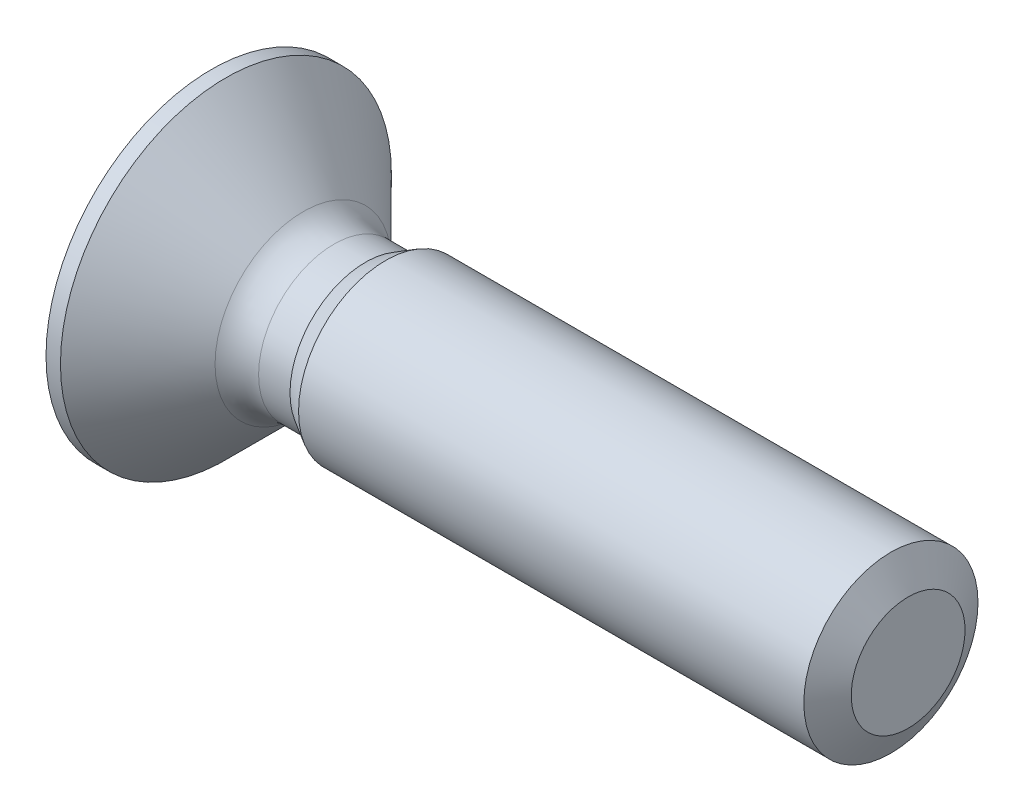
ISO-10303-21;
HEADER;
FILE_DESCRIPTION(('STEP AP214'),'2;1');
FILE_NAME('part.step','',(''),(''),'','','');
FILE_SCHEMA(('AUTOMOTIVE_DESIGN { 1 0 10303 214 1 1 1 1 }'));
ENDSEC;
DATA;
#1=APPLICATION_CONTEXT('core data for automotive mechanical design processes');
#2=APPLICATION_PROTOCOL_DEFINITION('international standard','automotive_design',2000,#1);
#3=PRODUCT_CONTEXT('',#1,'mechanical');
#4=PRODUCT('Part','Part','',(#3));
#5=PRODUCT_RELATED_PRODUCT_CATEGORY('part','',(#4));
#6=PRODUCT_DEFINITION_FORMATION('','',#4);
#7=PRODUCT_DEFINITION_CONTEXT('part definition',#1,'design');
#8=PRODUCT_DEFINITION('design','',#6,#7);
#9=PRODUCT_DEFINITION_SHAPE('','',#8);
#10=(LENGTH_UNIT() NAMED_UNIT(*) SI_UNIT(.MILLI.,.METRE.));
#11=(NAMED_UNIT(*) PLANE_ANGLE_UNIT() SI_UNIT($,.RADIAN.));
#12=(NAMED_UNIT(*) SI_UNIT($,.STERADIAN.) SOLID_ANGLE_UNIT());
#13=UNCERTAINTY_MEASURE_WITH_UNIT(LENGTH_MEASURE(1.E-05),#10,'distance_accuracy_value','');
#14=(GEOMETRIC_REPRESENTATION_CONTEXT(3) GLOBAL_UNCERTAINTY_ASSIGNED_CONTEXT((#13)) GLOBAL_UNIT_ASSIGNED_CONTEXT((#10,
#11,#12)) REPRESENTATION_CONTEXT('',''));
#15=CARTESIAN_POINT('',(0.,0.,0.));
#16=DIRECTION('',(0.,0.,1.));
#17=DIRECTION('',(1.,0.,0.));
#18=AXIS2_PLACEMENT_3D('',#15,#16,#17);
#19=CARTESIAN_POINT('',(0.,0.,0.));
#20=DIRECTION('',(1.,0.,0.));
#21=DIRECTION('',(0.,0.,-1.));
#22=AXIS2_PLACEMENT_3D('',#19,#20,#21);
#23=PLANE('',#22);
#24=CARTESIAN_POINT('',(0.,0.,0.));
#25=DIRECTION('',(-1.,0.,0.));
#26=DIRECTION('',(0.,0.,1.));
#27=AXIS2_PLACEMENT_3D('',#24,#25,#26);
#28=CIRCLE('',#27,1.9);
#29=CARTESIAN_POINT('',(0.,0.,1.9));
#30=VERTEX_POINT('',#29);
#31=EDGE_CURVE('E182',#30,#30,#28,.T.);
#32=ORIENTED_EDGE('',*,*,#31,.T.);
#33=EDGE_LOOP('',(#32));
#34=FACE_BOUND('',#33,.T.);
#35=DIRECTION('',(0.,1.,0.));
#36=VECTOR('',#35,1.);
#37=CARTESIAN_POINT('',(0.,0.95,0.200000000000003));
#38=LINE('',#37,#36);
#39=CARTESIAN_POINT('',(0.,0.2,0.200000000000001));
#40=VERTEX_POINT('',#39);
#41=CARTESIAN_POINT('',(0.,0.95,0.200000000000003));
#42=VERTEX_POINT('',#41);
#43=EDGE_CURVE('E104',#40,#42,#38,.T.);
#44=ORIENTED_EDGE('',*,*,#43,.F.);
#45=DIRECTION('',(0.,0.,-1.));
#46=VECTOR('',#45,1.);
#47=CARTESIAN_POINT('',(0.,0.2,-0.95));
#48=LINE('',#47,#46);
#49=CARTESIAN_POINT('',(0.,0.2,0.95));
#50=VERTEX_POINT('',#49);
#51=EDGE_CURVE('E149',#50,#40,#48,.T.);
#52=ORIENTED_EDGE('',*,*,#51,.F.);
#53=DIRECTION('',(0.,1.,0.));
#54=VECTOR('',#53,1.);
#55=CARTESIAN_POINT('',(0.,0.2,0.95));
#56=LINE('',#55,#54);
#57=CARTESIAN_POINT('',(0.,-0.2,0.95));
#58=VERTEX_POINT('',#57);
#59=EDGE_CURVE('E146',#58,#50,#56,.T.);
#60=ORIENTED_EDGE('',*,*,#59,.F.);
#61=DIRECTION('',(0.,0.,1.));
#62=VECTOR('',#61,1.);
#63=CARTESIAN_POINT('',(0.,-0.2,-0.95));
#64=LINE('',#63,#62);
#65=CARTESIAN_POINT('',(0.,-0.2,0.199999999999999));
#66=VERTEX_POINT('',#65);
#67=EDGE_CURVE('E77',#66,#58,#64,.T.);
#68=ORIENTED_EDGE('',*,*,#67,.F.);
#69=CARTESIAN_POINT('',(0.,-0.950000000000001,0.199999999999997));
#70=VERTEX_POINT('',#69);
#71=EDGE_CURVE('E112',#70,#66,#38,.T.);
#72=ORIENTED_EDGE('',*,*,#71,.F.);
#73=DIRECTION('',(0.,0.,1.));
#74=VECTOR('',#73,1.);
#75=CARTESIAN_POINT('',(0.,-0.950000000000001,0.199999999999997));
#76=LINE('',#75,#74);
#77=CARTESIAN_POINT('',(0.,-0.95,-0.200000000000003));
#78=VERTEX_POINT('',#77);
#79=EDGE_CURVE('E113',#78,#70,#76,.T.);
#80=ORIENTED_EDGE('',*,*,#79,.F.);
#81=DIRECTION('',(0.,-1.,0.));
#82=VECTOR('',#81,1.);
#83=CARTESIAN_POINT('',(0.,0.950000000000001,-0.199999999999997));
#84=LINE('',#83,#82);
#85=CARTESIAN_POINT('',(0.,-0.2,-0.200000000000001));
#86=VERTEX_POINT('',#85);
#87=EDGE_CURVE('E126',#86,#78,#84,.T.);
#88=ORIENTED_EDGE('',*,*,#87,.F.);
#89=CARTESIAN_POINT('',(0.,-0.2,-0.95));
#90=VERTEX_POINT('',#89);
#91=EDGE_CURVE('E143',#90,#86,#64,.T.);
#92=ORIENTED_EDGE('',*,*,#91,.F.);
#93=DIRECTION('',(0.,-1.,0.));
#94=VECTOR('',#93,1.);
#95=CARTESIAN_POINT('',(0.,0.2,-0.95));
#96=LINE('',#95,#94);
#97=CARTESIAN_POINT('',(0.,0.2,-0.95));
#98=VERTEX_POINT('',#97);
#99=EDGE_CURVE('E54',#98,#90,#96,.T.);
#100=ORIENTED_EDGE('',*,*,#99,.F.);
#101=CARTESIAN_POINT('',(0.,0.2,-0.199999999999999));
#102=VERTEX_POINT('',#101);
#103=EDGE_CURVE('E152',#102,#98,#48,.T.);
#104=ORIENTED_EDGE('',*,*,#103,.F.);
#105=CARTESIAN_POINT('',(0.,0.950000000000001,-0.199999999999997));
#106=VERTEX_POINT('',#105);
#107=EDGE_CURVE('E125',#106,#102,#84,.T.);
#108=ORIENTED_EDGE('',*,*,#107,.F.);
#109=DIRECTION('',(0.,0.,-1.));
#110=VECTOR('',#109,1.);
#111=CARTESIAN_POINT('',(0.,0.95,0.200000000000003));
#112=LINE('',#111,#110);
#113=EDGE_CURVE('E118',#42,#106,#112,.T.);
#114=ORIENTED_EDGE('',*,*,#113,.F.);
#115=EDGE_LOOP('',(#44,#52,#60,#68,#72,#80,#88,#92,#100,#104,#108,#114));
#116=FACE_BOUND('',#115,.T.);
#117=ADVANCED_FACE('F40',(#34,#116),#23,.F.);
#118=CARTESIAN_POINT('',(1.2,0.,0.));
#119=DIRECTION('',(-0.164398987305357,-0.986393923832144,0.));
#120=DIRECTION('',(0.986393923832144,-0.164398987305357,0.));
#121=AXIS2_PLACEMENT_3D('',#118,#119,#120);
#122=PLANE('',#121);
#123=ORIENTED_EDGE('',*,*,#51,.T.);
#124=DIRECTION('',(0.973328526784575,-0.162221421130763,-0.162221421130763));
#125=VECTOR('',#124,1.);
#126=CARTESIAN_POINT('',(1.2,0.,0.));
#127=LINE('',#126,#125);
#128=CARTESIAN_POINT('',(1.2,0.,0.));
#129=VERTEX_POINT('',#128);
#130=EDGE_CURVE('E83',#40,#129,#127,.T.);
#131=ORIENTED_EDGE('',*,*,#130,.T.);
#132=DIRECTION('',(0.777436258070084,-0.129572709678347,-0.61547037097215));
#133=VECTOR('',#132,1.);
#134=CARTESIAN_POINT('',(0.,0.2,0.95));
#135=LINE('',#134,#133);
#136=EDGE_CURVE('E63',#50,#129,#135,.T.);
#137=ORIENTED_EDGE('',*,*,#136,.F.);
#138=EDGE_LOOP('',(#123,#131,#137));
#139=FACE_BOUND('',#138,.T.);
#140=ADVANCED_FACE('F198',(#139),#122,.T.);
#141=DIRECTION('',(0.777436258070084,-0.129572709678347,0.61547037097215));
#142=VECTOR('',#141,1.);
#143=CARTESIAN_POINT('',(0.,0.2,-0.95));
#144=LINE('',#143,#142);
#145=EDGE_CURVE('E148',#98,#129,#144,.T.);
#146=ORIENTED_EDGE('',*,*,#145,.T.);
#147=DIRECTION('',(-0.973328526784575,0.162221421130763,-0.162221421130762));
#148=VECTOR('',#147,1.);
#149=CARTESIAN_POINT('',(1.2,0.,0.));
#150=LINE('',#149,#148);
#151=EDGE_CURVE('E130',#129,#102,#150,.T.);
#152=ORIENTED_EDGE('',*,*,#151,.T.);
#153=ORIENTED_EDGE('',*,*,#103,.T.);
#154=EDGE_LOOP('',(#146,#152,#153));
#155=FACE_BOUND('',#154,.T.);
#156=ADVANCED_FACE('F192',(#155),#122,.T.);
#157=CARTESIAN_POINT('',(1.2,0.,0.));
#158=DIRECTION('',(-0.164398987305357,0.986393923832144,0.));
#159=DIRECTION('',(-0.986393923832144,-0.164398987305357,0.));
#160=AXIS2_PLACEMENT_3D('',#157,#158,#159);
#161=PLANE('',#160);
#162=DIRECTION('',(0.777436258070084,0.129572709678347,-0.61547037097215));
#163=VECTOR('',#162,1.);
#164=CARTESIAN_POINT('',(0.,-0.2,0.95));
#165=LINE('',#164,#163);
#166=EDGE_CURVE('E142',#58,#129,#165,.T.);
#167=ORIENTED_EDGE('',*,*,#166,.T.);
#168=DIRECTION('',(-0.973328526784575,-0.162221421130763,0.162221421130762));
#169=VECTOR('',#168,1.);
#170=CARTESIAN_POINT('',(1.2,0.,0.));
#171=LINE('',#170,#169);
#172=EDGE_CURVE('E11',#129,#66,#171,.T.);
#173=ORIENTED_EDGE('',*,*,#172,.T.);
#174=ORIENTED_EDGE('',*,*,#67,.T.);
#175=EDGE_LOOP('',(#167,#173,#174));
#176=FACE_BOUND('',#175,.T.);
#177=ADVANCED_FACE('F193',(#176),#161,.T.);
#178=ORIENTED_EDGE('',*,*,#91,.T.);
#179=DIRECTION('',(0.973328526784575,0.162221421130763,0.162221421130763));
#180=VECTOR('',#179,1.);
#181=CARTESIAN_POINT('',(1.2,0.,0.));
#182=LINE('',#181,#180);
#183=EDGE_CURVE('E47',#86,#129,#182,.T.);
#184=ORIENTED_EDGE('',*,*,#183,.T.);
#185=DIRECTION('',(0.777436258070084,0.129572709678347,0.61547037097215));
#186=VECTOR('',#185,1.);
#187=CARTESIAN_POINT('',(0.,-0.2,-0.95));
#188=LINE('',#187,#186);
#189=EDGE_CURVE('E157',#90,#129,#188,.T.);
#190=ORIENTED_EDGE('',*,*,#189,.F.);
#191=EDGE_LOOP('',(#178,#184,#190));
#192=FACE_BOUND('',#191,.T.);
#193=ADVANCED_FACE('F186',(#192),#161,.T.);
#194=CARTESIAN_POINT('',(0.,0.,0.));
#195=DIRECTION('',(-1.,0.,0.));
#196=DIRECTION('',(0.,0.,1.));
#197=AXIS2_PLACEMENT_3D('',#194,#195,#196);
#198=CYLINDRICAL_SURFACE('',#197,1.9);
#199=ORIENTED_EDGE('',*,*,#31,.F.);
#200=EDGE_LOOP('',(#199));
#201=FACE_BOUND('',#200,.T.);
#202=CARTESIAN_POINT('',(0.166000000000004,0.,0.));
#203=DIRECTION('',(-1.,0.,0.));
#204=DIRECTION('',(0.,0.,1.));
#205=AXIS2_PLACEMENT_3D('',#202,#203,#204);
#206=CIRCLE('',#205,1.9);
#207=CARTESIAN_POINT('',(0.166000000000004,0.,1.9));
#208=VERTEX_POINT('',#207);
#209=EDGE_CURVE('E178',#208,#208,#206,.T.);
#210=ORIENTED_EDGE('',*,*,#209,.T.);
#211=EDGE_LOOP('',(#210));
#212=FACE_BOUND('',#211,.T.);
#213=ADVANCED_FACE('F226',(#201,#212),#198,.T.);
#214=CARTESIAN_POINT('',(1.05355339059327,0.,0.));
#215=DIRECTION('',(-1.,0.,0.));
#216=DIRECTION('',(0.,0.,1.));
#217=AXIS2_PLACEMENT_3D('',#214,#215,#216);
#218=CONICAL_SURFACE('',#217,1.01244660940673,0.78539816339745);
#219=ORIENTED_EDGE('',*,*,#209,.F.);
#220=EDGE_LOOP('',(#219));
#221=FACE_BOUND('',#220,.T.);
#222=CARTESIAN_POINT('',(1.05355339059327,0.,0.));
#223=DIRECTION('',(-1.,0.,0.));
#224=DIRECTION('',(0.,0.,1.));
#225=AXIS2_PLACEMENT_3D('',#222,#223,#224);
#226=CIRCLE('',#225,1.01244660940673);
#227=CARTESIAN_POINT('',(1.05355339059327,0.,1.01244660940673));
#228=VERTEX_POINT('',#227);
#229=EDGE_CURVE('E174',#228,#228,#226,.T.);
#230=ORIENTED_EDGE('',*,*,#229,.T.);
#231=EDGE_LOOP('',(#230));
#232=FACE_BOUND('',#231,.T.);
#233=ADVANCED_FACE('F229',(#221,#232),#218,.T.);
#234=CARTESIAN_POINT('',(1.40710678118655,0.,0.));
#235=DIRECTION('',(-1.,0.,0.));
#236=DIRECTION('',(0.,0.,1.));
#237=AXIS2_PLACEMENT_3D('',#234,#235,#236);
#238=TOROIDAL_SURFACE('',#237,1.366,0.5);
#239=ORIENTED_EDGE('',*,*,#229,.F.);
#240=EDGE_LOOP('',(#239));
#241=FACE_BOUND('',#240,.T.);
#242=CARTESIAN_POINT('',(1.40710678118655,0.,0.));
#243=DIRECTION('',(-1.,0.,0.));
#244=DIRECTION('',(0.,0.,1.));
#245=AXIS2_PLACEMENT_3D('',#242,#243,#244);
#246=CIRCLE('',#245,0.866);
#247=CARTESIAN_POINT('',(1.40710678118655,0.,0.866));
#248=VERTEX_POINT('',#247);
#249=EDGE_CURVE('E171',#248,#248,#246,.T.);
#250=ORIENTED_EDGE('',*,*,#249,.T.);
#251=EDGE_LOOP('',(#250));
#252=FACE_BOUND('',#251,.T.);
#253=ADVANCED_FACE('F234',(#241,#252),#238,.F.);
#254=CARTESIAN_POINT('',(0.,0.,0.));
#255=DIRECTION('',(-1.,0.,0.));
#256=DIRECTION('',(0.,0.,1.));
#257=AXIS2_PLACEMENT_3D('',#254,#255,#256);
#258=CYLINDRICAL_SURFACE('',#257,0.866);
#259=ORIENTED_EDGE('',*,*,#249,.F.);
#260=EDGE_LOOP('',(#259));
#261=FACE_BOUND('',#260,.T.);
#262=CARTESIAN_POINT('',(1.76790519178577,0.,0.));
#263=DIRECTION('',(-1.,0.,0.));
#264=DIRECTION('',(0.,0.,1.));
#265=AXIS2_PLACEMENT_3D('',#262,#263,#264);
#266=CIRCLE('',#265,0.866);
#267=CARTESIAN_POINT('',(1.76790519178577,0.,0.866));
#268=VERTEX_POINT('',#267);
#269=EDGE_CURVE('E168',#268,#268,#266,.T.);
#270=ORIENTED_EDGE('',*,*,#269,.T.);
#271=EDGE_LOOP('',(#270));
#272=FACE_BOUND('',#271,.T.);
#273=ADVANCED_FACE('F240',(#261,#272),#258,.T.);
#274=CARTESIAN_POINT('',(2.,0.,0.));
#275=DIRECTION('',(1.,0.,0.));
#276=DIRECTION('',(0.,0.,-1.));
#277=AXIS2_PLACEMENT_3D('',#274,#275,#276);
#278=CONICAL_SURFACE('',#277,1.,0.5235987755983);
#279=ORIENTED_EDGE('',*,*,#269,.F.);
#280=EDGE_LOOP('',(#279));
#281=FACE_BOUND('',#280,.T.);
#282=CARTESIAN_POINT('',(2.,0.,0.));
#283=DIRECTION('',(-1.,0.,0.));
#284=DIRECTION('',(0.,0.,1.));
#285=AXIS2_PLACEMENT_3D('',#282,#283,#284);
#286=CIRCLE('',#285,1.);
#287=CARTESIAN_POINT('',(2.,0.,1.));
#288=VERTEX_POINT('',#287);
#289=EDGE_CURVE('E165',#288,#288,#286,.T.);
#290=ORIENTED_EDGE('',*,*,#289,.T.);
#291=EDGE_LOOP('',(#290));
#292=FACE_BOUND('',#291,.T.);
#293=ADVANCED_FACE('F246',(#281,#292),#278,.T.);
#294=CARTESIAN_POINT('',(0.,0.,0.));
#295=DIRECTION('',(-1.,0.,0.));
#296=DIRECTION('',(0.,0.,1.));
#297=AXIS2_PLACEMENT_3D('',#294,#295,#296);
#298=CYLINDRICAL_SURFACE('',#297,1.);
#299=CARTESIAN_POINT('',(7.802166402297,0.,0.));
#300=DIRECTION('',(1.,0.,0.));
#301=DIRECTION('',(0.,0.,-1.));
#302=AXIS2_PLACEMENT_3D('',#299,#300,#301);
#303=CIRCLE('',#302,1.);
#304=CARTESIAN_POINT('',(7.802166402297,0.,-1.));
#305=VERTEX_POINT('',#304);
#306=EDGE_CURVE('E162',#305,#305,#303,.T.);
#307=ORIENTED_EDGE('',*,*,#306,.F.);
#308=EDGE_LOOP('',(#307));
#309=FACE_BOUND('',#308,.T.);
#310=ORIENTED_EDGE('',*,*,#289,.F.);
#311=EDGE_LOOP('',(#310));
#312=FACE_BOUND('',#311,.T.);
#313=ADVANCED_FACE('F252',(#309,#312),#298,.T.);
#314=CARTESIAN_POINT('',(7.802166402297,0.,0.));
#315=DIRECTION('',(-1.,0.,0.));
#316=DIRECTION('',(0.,0.,1.));
#317=AXIS2_PLACEMENT_3D('',#314,#315,#316);
#318=CONICAL_SURFACE('',#317,1.,1.05188801855137);
#319=CARTESIAN_POINT('',(8.,0.,0.));
#320=DIRECTION('',(1.,0.,0.));
#321=DIRECTION('',(0.,0.,-1.));
#322=AXIS2_PLACEMENT_3D('',#319,#320,#321);
#323=CIRCLE('',#322,0.6536);
#324=CARTESIAN_POINT('',(8.,0.,-0.6536));
#325=VERTEX_POINT('',#324);
#326=EDGE_CURVE('E151',#325,#325,#323,.T.);
#327=ORIENTED_EDGE('',*,*,#326,.F.);
#328=EDGE_LOOP('',(#327));
#329=FACE_BOUND('',#328,.T.);
#330=ORIENTED_EDGE('',*,*,#306,.T.);
#331=EDGE_LOOP('',(#330));
#332=FACE_BOUND('',#331,.T.);
#333=ADVANCED_FACE('F257',(#329,#332),#318,.T.);
#334=CARTESIAN_POINT('',(8.,1.,0.));
#335=DIRECTION('',(-1.,0.,0.));
#336=DIRECTION('',(0.,0.,1.));
#337=AXIS2_PLACEMENT_3D('',#334,#335,#336);
#338=PLANE('',#337);
#339=ORIENTED_EDGE('',*,*,#326,.T.);
#340=EDGE_LOOP('',(#339));
#341=FACE_BOUND('',#340,.T.);
#342=ADVANCED_FACE('F263',(#341),#338,.F.);
#343=CARTESIAN_POINT('',(0.,0.2,-0.95));
#344=DIRECTION('',(0.620702944365561,0.,-0.784045824461761));
#345=DIRECTION('',(-0.784045824461762,0.,-0.620702944365561));
#346=AXIS2_PLACEMENT_3D('',#343,#344,#345);
#347=PLANE('',#346);
#348=ORIENTED_EDGE('',*,*,#145,.F.);
#349=ORIENTED_EDGE('',*,*,#99,.T.);
#350=ORIENTED_EDGE('',*,*,#189,.T.);
#351=EDGE_LOOP('',(#348,#349,#350));
#352=FACE_BOUND('',#351,.T.);
#353=ADVANCED_FACE('F190',(#352),#347,.F.);
#354=CARTESIAN_POINT('',(0.,-0.2,0.95));
#355=DIRECTION('',(0.620702944365561,0.,0.784045824461761));
#356=DIRECTION('',(0.784045824461762,0.,-0.620702944365561));
#357=AXIS2_PLACEMENT_3D('',#354,#355,#356);
#358=PLANE('',#357);
#359=ORIENTED_EDGE('',*,*,#166,.F.);
#360=ORIENTED_EDGE('',*,*,#59,.T.);
#361=ORIENTED_EDGE('',*,*,#136,.T.);
#362=EDGE_LOOP('',(#359,#360,#361));
#363=FACE_BOUND('',#362,.T.);
#364=ADVANCED_FACE('F197',(#363),#358,.F.);
#365=CARTESIAN_POINT('',(1.2,0.,0.));
#366=DIRECTION('',(-0.164398987305357,0.,-0.986393923832144));
#367=DIRECTION('',(0.986393923832144,0.,-0.164398987305357));
#368=AXIS2_PLACEMENT_3D('',#365,#366,#367);
#369=PLANE('',#368);
#370=DIRECTION('',(0.777436258070084,0.615470370972151,-0.129572709678345));
#371=VECTOR('',#370,1.);
#372=CARTESIAN_POINT('',(0.,-0.950000000000001,0.199999999999997));
#373=LINE('',#372,#371);
#374=EDGE_CURVE('E122',#70,#129,#373,.T.);
#375=ORIENTED_EDGE('',*,*,#374,.F.);
#376=ORIENTED_EDGE('',*,*,#71,.T.);
#377=ORIENTED_EDGE('',*,*,#172,.F.);
#378=EDGE_LOOP('',(#375,#376,#377));
#379=FACE_BOUND('',#378,.T.);
#380=ADVANCED_FACE('F202',(#379),#369,.T.);
#381=CARTESIAN_POINT('',(1.2,0.,0.));
#382=DIRECTION('',(-0.164398987305357,0.,0.986393923832144));
#383=DIRECTION('',(-0.986393923832144,0.,-0.164398987305357));
#384=AXIS2_PLACEMENT_3D('',#381,#382,#383);
#385=PLANE('',#384);
#386=ORIENTED_EDGE('',*,*,#87,.T.);
#387=DIRECTION('',(0.777436258070084,0.61547037097215,0.12957270967835));
#388=VECTOR('',#387,1.);
#389=CARTESIAN_POINT('',(0.,-0.95,-0.200000000000003));
#390=LINE('',#389,#388);
#391=EDGE_CURVE('E136',#78,#129,#390,.T.);
#392=ORIENTED_EDGE('',*,*,#391,.T.);
#393=ORIENTED_EDGE('',*,*,#183,.F.);
#394=EDGE_LOOP('',(#386,#392,#393));
#395=FACE_BOUND('',#394,.T.);
#396=ADVANCED_FACE('F206',(#395),#385,.T.);
#397=CARTESIAN_POINT('',(0.,-0.95,-0.200000000000003));
#398=DIRECTION('',(0.620702944365561,-0.784045824461761,0.));
#399=DIRECTION('',(0.784045824461762,0.620702944365561,0.));
#400=AXIS2_PLACEMENT_3D('',#397,#398,#399);
#401=PLANE('',#400);
#402=ORIENTED_EDGE('',*,*,#391,.F.);
#403=ORIENTED_EDGE('',*,*,#79,.T.);
#404=ORIENTED_EDGE('',*,*,#374,.T.);
#405=EDGE_LOOP('',(#402,#403,#404));
#406=FACE_BOUND('',#405,.T.);
#407=ADVANCED_FACE('F205',(#406),#401,.F.);
#408=ORIENTED_EDGE('',*,*,#43,.T.);
#409=DIRECTION('',(0.777436258070084,-0.61547037097215,-0.12957270967835));
#410=VECTOR('',#409,1.);
#411=CARTESIAN_POINT('',(0.,0.95,0.200000000000003));
#412=LINE('',#411,#410);
#413=EDGE_CURVE('E107',#42,#129,#412,.T.);
#414=ORIENTED_EDGE('',*,*,#413,.T.);
#415=ORIENTED_EDGE('',*,*,#130,.F.);
#416=EDGE_LOOP('',(#408,#414,#415));
#417=FACE_BOUND('',#416,.T.);
#418=ADVANCED_FACE('F106',(#417),#369,.T.);
#419=DIRECTION('',(0.777436258070084,-0.615470370972151,0.129572709678345));
#420=VECTOR('',#419,1.);
#421=CARTESIAN_POINT('',(0.,0.950000000000001,-0.199999999999997));
#422=LINE('',#421,#420);
#423=EDGE_CURVE('E120',#106,#129,#422,.T.);
#424=ORIENTED_EDGE('',*,*,#423,.F.);
#425=ORIENTED_EDGE('',*,*,#107,.T.);
#426=ORIENTED_EDGE('',*,*,#151,.F.);
#427=EDGE_LOOP('',(#424,#425,#426));
#428=FACE_BOUND('',#427,.T.);
#429=ADVANCED_FACE('F209',(#428),#385,.T.);
#430=CARTESIAN_POINT('',(0.,0.95,0.200000000000003));
#431=DIRECTION('',(0.620702944365561,0.784045824461761,0.));
#432=DIRECTION('',(-0.784045824461762,0.620702944365561,0.));
#433=AXIS2_PLACEMENT_3D('',#430,#431,#432);
#434=PLANE('',#433);
#435=ORIENTED_EDGE('',*,*,#413,.F.);
#436=ORIENTED_EDGE('',*,*,#113,.T.);
#437=ORIENTED_EDGE('',*,*,#423,.T.);
#438=EDGE_LOOP('',(#435,#436,#437));
#439=FACE_BOUND('',#438,.T.);
#440=ADVANCED_FACE('F117',(#439),#434,.F.);
#441=CLOSED_SHELL('',(#117,#140,#156,#177,#193,#213,#233,#253,#273,#293,#313,#333,#342,#353,
#364,#380,#396,#407,#418,#429,#440));
#442=MANIFOLD_SOLID_BREP('B2',#441);
#443=ADVANCED_BREP_SHAPE_REPRESENTATION('',(#18,#442),#14);
#444=SHAPE_DEFINITION_REPRESENTATION(#9,#443);
ENDSEC;
END-ISO-10303-21;
